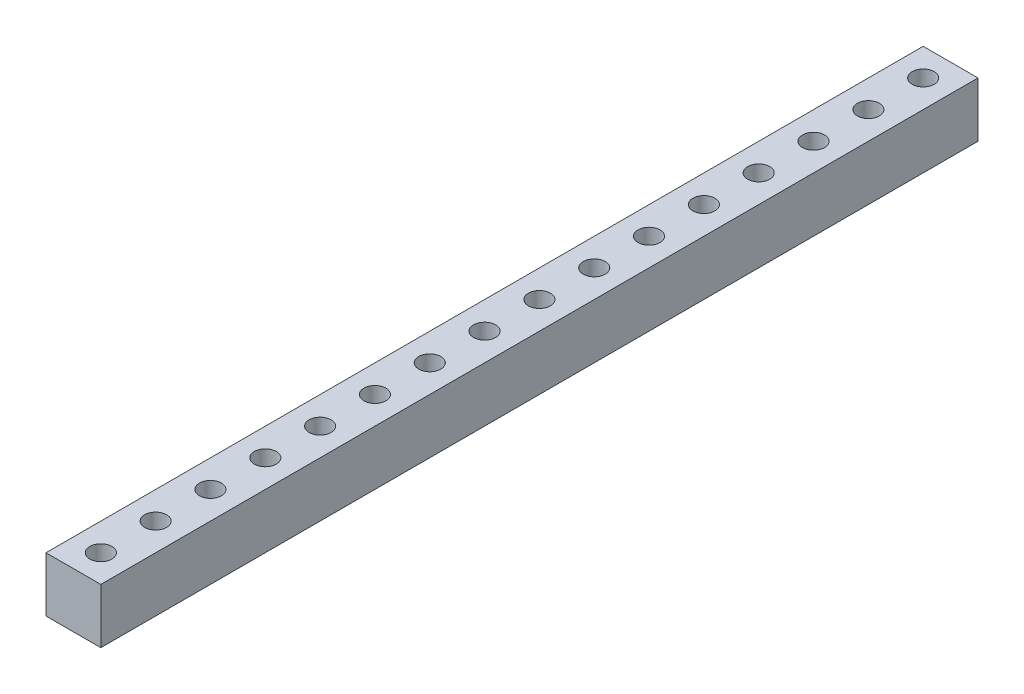
ISO-10303-21;
HEADER;
FILE_DESCRIPTION(('STEP AP214'),'2;1');
FILE_NAME('part.step','',(''),(''),'','','');
FILE_SCHEMA(('AUTOMOTIVE_DESIGN { 1 0 10303 214 1 1 1 1 }'));
ENDSEC;
DATA;
#1=APPLICATION_CONTEXT('core data for automotive mechanical design processes');
#2=APPLICATION_PROTOCOL_DEFINITION('international standard','automotive_design',2000,#1);
#3=PRODUCT_CONTEXT('',#1,'mechanical');
#4=PRODUCT('Part','Part','',(#3));
#5=PRODUCT_RELATED_PRODUCT_CATEGORY('part','',(#4));
#6=PRODUCT_DEFINITION_FORMATION('','',#4);
#7=PRODUCT_DEFINITION_CONTEXT('part definition',#1,'design');
#8=PRODUCT_DEFINITION('design','',#6,#7);
#9=PRODUCT_DEFINITION_SHAPE('','',#8);
#10=(LENGTH_UNIT() NAMED_UNIT(*) SI_UNIT(.MILLI.,.METRE.));
#11=(NAMED_UNIT(*) PLANE_ANGLE_UNIT() SI_UNIT($,.RADIAN.));
#12=(NAMED_UNIT(*) SI_UNIT($,.STERADIAN.) SOLID_ANGLE_UNIT());
#13=UNCERTAINTY_MEASURE_WITH_UNIT(LENGTH_MEASURE(1.E-05),#10,'distance_accuracy_value','');
#14=(GEOMETRIC_REPRESENTATION_CONTEXT(3) GLOBAL_UNCERTAINTY_ASSIGNED_CONTEXT((#13)) GLOBAL_UNIT_ASSIGNED_CONTEXT((#10,
#11,#12)) REPRESENTATION_CONTEXT('',''));
#15=CARTESIAN_POINT('',(0.,0.,0.));
#16=DIRECTION('',(0.,0.,1.));
#17=DIRECTION('',(1.,0.,0.));
#18=AXIS2_PLACEMENT_3D('',#15,#16,#17);
#19=CARTESIAN_POINT('',(2.54,-1.27,-20.32));
#20=DIRECTION('',(0.,0.,1.));
#21=DIRECTION('',(1.,0.,0.));
#22=AXIS2_PLACEMENT_3D('',#19,#20,#21);
#23=PLANE('',#22);
#24=DIRECTION('',(0.,1.,0.));
#25=VECTOR('',#24,1.);
#26=CARTESIAN_POINT('',(0.,-1.27,-20.32));
#27=LINE('',#26,#25);
#28=CARTESIAN_POINT('',(0.,-1.27,-20.32));
#29=VERTEX_POINT('',#28);
#30=CARTESIAN_POINT('',(0.,1.27,-20.32));
#31=VERTEX_POINT('',#30);
#32=EDGE_CURVE('E107',#29,#31,#27,.T.);
#33=ORIENTED_EDGE('',*,*,#32,.T.);
#34=DIRECTION('',(-1.,0.,0.));
#35=VECTOR('',#34,1.);
#36=CARTESIAN_POINT('',(2.54,1.27,-20.32));
#37=LINE('',#36,#35);
#38=CARTESIAN_POINT('',(2.54,1.27,-20.32));
#39=VERTEX_POINT('',#38);
#40=EDGE_CURVE('E11',#39,#31,#37,.T.);
#41=ORIENTED_EDGE('',*,*,#40,.F.);
#42=DIRECTION('',(0.,1.,0.));
#43=VECTOR('',#42,1.);
#44=CARTESIAN_POINT('',(2.54,-1.27,-20.32));
#45=LINE('',#44,#43);
#46=CARTESIAN_POINT('',(2.54,-1.27,-20.32));
#47=VERTEX_POINT('',#46);
#48=EDGE_CURVE('E91',#47,#39,#45,.T.);
#49=ORIENTED_EDGE('',*,*,#48,.F.);
#50=DIRECTION('',(-1.,0.,0.));
#51=VECTOR('',#50,1.);
#52=CARTESIAN_POINT('',(2.54,-1.27,-20.32));
#53=LINE('',#52,#51);
#54=EDGE_CURVE('E103',#47,#29,#53,.T.);
#55=ORIENTED_EDGE('',*,*,#54,.T.);
#56=EDGE_LOOP('',(#33,#41,#49,#55));
#57=FACE_BOUND('',#56,.T.);
#58=ADVANCED_FACE('F39',(#57),#23,.F.);
#59=CARTESIAN_POINT('',(2.54,1.27,20.32));
#60=DIRECTION('',(0.,-1.,0.));
#61=DIRECTION('',(0.,0.,-1.));
#62=AXIS2_PLACEMENT_3D('',#59,#60,#61);
#63=PLANE('',#62);
#64=CARTESIAN_POINT('',(1.27,1.27,-19.05));
#65=DIRECTION('',(0.,1.,0.));
#66=DIRECTION('',(0.,0.,1.));
#67=AXIS2_PLACEMENT_3D('',#64,#65,#66);
#68=CIRCLE('',#67,0.51);
#69=CARTESIAN_POINT('',(1.27,1.27,-18.54));
#70=VERTEX_POINT('',#69);
#71=EDGE_CURVE('E251',#70,#70,#68,.T.);
#72=ORIENTED_EDGE('',*,*,#71,.F.);
#73=EDGE_LOOP('',(#72));
#74=FACE_BOUND('',#73,.T.);
#75=CARTESIAN_POINT('',(1.27,1.27,-16.51));
#76=DIRECTION('',(0.,1.,0.));
#77=DIRECTION('',(0.,0.,1.));
#78=AXIS2_PLACEMENT_3D('',#75,#76,#77);
#79=CIRCLE('',#78,0.51);
#80=CARTESIAN_POINT('',(1.27,1.27,-16.));
#81=VERTEX_POINT('',#80);
#82=EDGE_CURVE('E243',#81,#81,#79,.T.);
#83=ORIENTED_EDGE('',*,*,#82,.F.);
#84=EDGE_LOOP('',(#83));
#85=FACE_BOUND('',#84,.T.);
#86=CARTESIAN_POINT('',(1.27,1.27,-13.97));
#87=DIRECTION('',(0.,1.,0.));
#88=DIRECTION('',(0.,0.,1.));
#89=AXIS2_PLACEMENT_3D('',#86,#87,#88);
#90=CIRCLE('',#89,0.51);
#91=CARTESIAN_POINT('',(1.27,1.27,-13.46));
#92=VERTEX_POINT('',#91);
#93=EDGE_CURVE('E235',#92,#92,#90,.T.);
#94=ORIENTED_EDGE('',*,*,#93,.F.);
#95=EDGE_LOOP('',(#94));
#96=FACE_BOUND('',#95,.T.);
#97=CARTESIAN_POINT('',(1.27,1.27,-11.43));
#98=DIRECTION('',(0.,1.,0.));
#99=DIRECTION('',(0.,0.,1.));
#100=AXIS2_PLACEMENT_3D('',#97,#98,#99);
#101=CIRCLE('',#100,0.51);
#102=CARTESIAN_POINT('',(1.27,1.27,-10.92));
#103=VERTEX_POINT('',#102);
#104=EDGE_CURVE('E227',#103,#103,#101,.T.);
#105=ORIENTED_EDGE('',*,*,#104,.F.);
#106=EDGE_LOOP('',(#105));
#107=FACE_BOUND('',#106,.T.);
#108=CARTESIAN_POINT('',(1.27,1.27,-8.89));
#109=DIRECTION('',(0.,1.,0.));
#110=DIRECTION('',(0.,0.,1.));
#111=AXIS2_PLACEMENT_3D('',#108,#109,#110);
#112=CIRCLE('',#111,0.51);
#113=CARTESIAN_POINT('',(1.27,1.27,-8.38));
#114=VERTEX_POINT('',#113);
#115=EDGE_CURVE('E219',#114,#114,#112,.T.);
#116=ORIENTED_EDGE('',*,*,#115,.F.);
#117=EDGE_LOOP('',(#116));
#118=FACE_BOUND('',#117,.T.);
#119=CARTESIAN_POINT('',(1.27,1.27,-6.34999999999999));
#120=DIRECTION('',(0.,1.,0.));
#121=DIRECTION('',(0.,0.,1.));
#122=AXIS2_PLACEMENT_3D('',#119,#120,#121);
#123=CIRCLE('',#122,0.51);
#124=CARTESIAN_POINT('',(1.27,1.27,-5.83999999999999));
#125=VERTEX_POINT('',#124);
#126=EDGE_CURVE('E211',#125,#125,#123,.T.);
#127=ORIENTED_EDGE('',*,*,#126,.F.);
#128=EDGE_LOOP('',(#127));
#129=FACE_BOUND('',#128,.T.);
#130=CARTESIAN_POINT('',(1.27,1.27,-3.80999999999999));
#131=DIRECTION('',(0.,1.,0.));
#132=DIRECTION('',(0.,0.,1.));
#133=AXIS2_PLACEMENT_3D('',#130,#131,#132);
#134=CIRCLE('',#133,0.51);
#135=CARTESIAN_POINT('',(1.27,1.27,-3.29999999999999));
#136=VERTEX_POINT('',#135);
#137=EDGE_CURVE('E203',#136,#136,#134,.T.);
#138=ORIENTED_EDGE('',*,*,#137,.F.);
#139=EDGE_LOOP('',(#138));
#140=FACE_BOUND('',#139,.T.);
#141=CARTESIAN_POINT('',(1.27,1.27,-1.26999999999999));
#142=DIRECTION('',(0.,1.,0.));
#143=DIRECTION('',(0.,0.,1.));
#144=AXIS2_PLACEMENT_3D('',#141,#142,#143);
#145=CIRCLE('',#144,0.51);
#146=CARTESIAN_POINT('',(1.27,1.27,-0.759999999999994));
#147=VERTEX_POINT('',#146);
#148=EDGE_CURVE('E195',#147,#147,#145,.T.);
#149=ORIENTED_EDGE('',*,*,#148,.F.);
#150=EDGE_LOOP('',(#149));
#151=FACE_BOUND('',#150,.T.);
#152=CARTESIAN_POINT('',(1.27,1.27,1.27000000000001));
#153=DIRECTION('',(0.,1.,0.));
#154=DIRECTION('',(0.,0.,1.));
#155=AXIS2_PLACEMENT_3D('',#152,#153,#154);
#156=CIRCLE('',#155,0.51);
#157=CARTESIAN_POINT('',(1.27,1.27,1.78000000000001));
#158=VERTEX_POINT('',#157);
#159=EDGE_CURVE('E187',#158,#158,#156,.T.);
#160=ORIENTED_EDGE('',*,*,#159,.F.);
#161=EDGE_LOOP('',(#160));
#162=FACE_BOUND('',#161,.T.);
#163=CARTESIAN_POINT('',(1.27,1.27,3.81000000000001));
#164=DIRECTION('',(0.,1.,0.));
#165=DIRECTION('',(0.,0.,1.));
#166=AXIS2_PLACEMENT_3D('',#163,#164,#165);
#167=CIRCLE('',#166,0.51);
#168=CARTESIAN_POINT('',(1.27,1.27,4.32000000000001));
#169=VERTEX_POINT('',#168);
#170=EDGE_CURVE('E179',#169,#169,#167,.T.);
#171=ORIENTED_EDGE('',*,*,#170,.F.);
#172=EDGE_LOOP('',(#171));
#173=FACE_BOUND('',#172,.T.);
#174=CARTESIAN_POINT('',(1.27,1.27,6.35000000000001));
#175=DIRECTION('',(0.,1.,0.));
#176=DIRECTION('',(0.,0.,1.));
#177=AXIS2_PLACEMENT_3D('',#174,#175,#176);
#178=CIRCLE('',#177,0.51);
#179=CARTESIAN_POINT('',(1.27,1.27,6.86000000000001));
#180=VERTEX_POINT('',#179);
#181=EDGE_CURVE('E171',#180,#180,#178,.T.);
#182=ORIENTED_EDGE('',*,*,#181,.F.);
#183=EDGE_LOOP('',(#182));
#184=FACE_BOUND('',#183,.T.);
#185=CARTESIAN_POINT('',(1.27,1.27,8.89000000000001));
#186=DIRECTION('',(0.,1.,0.));
#187=DIRECTION('',(0.,0.,1.));
#188=AXIS2_PLACEMENT_3D('',#185,#186,#187);
#189=CIRCLE('',#188,0.51);
#190=CARTESIAN_POINT('',(1.27,1.27,9.40000000000001));
#191=VERTEX_POINT('',#190);
#192=EDGE_CURVE('E163',#191,#191,#189,.T.);
#193=ORIENTED_EDGE('',*,*,#192,.F.);
#194=EDGE_LOOP('',(#193));
#195=FACE_BOUND('',#194,.T.);
#196=CARTESIAN_POINT('',(1.27,1.27,11.43));
#197=DIRECTION('',(0.,1.,0.));
#198=DIRECTION('',(0.,0.,1.));
#199=AXIS2_PLACEMENT_3D('',#196,#197,#198);
#200=CIRCLE('',#199,0.51);
#201=CARTESIAN_POINT('',(1.27,1.27,11.94));
#202=VERTEX_POINT('',#201);
#203=EDGE_CURVE('E155',#202,#202,#200,.T.);
#204=ORIENTED_EDGE('',*,*,#203,.F.);
#205=EDGE_LOOP('',(#204));
#206=FACE_BOUND('',#205,.T.);
#207=CARTESIAN_POINT('',(1.27,1.27,13.97));
#208=DIRECTION('',(0.,1.,0.));
#209=DIRECTION('',(0.,0.,1.));
#210=AXIS2_PLACEMENT_3D('',#207,#208,#209);
#211=CIRCLE('',#210,0.51);
#212=CARTESIAN_POINT('',(1.27,1.27,14.48));
#213=VERTEX_POINT('',#212);
#214=EDGE_CURVE('E147',#213,#213,#211,.T.);
#215=ORIENTED_EDGE('',*,*,#214,.F.);
#216=EDGE_LOOP('',(#215));
#217=FACE_BOUND('',#216,.T.);
#218=CARTESIAN_POINT('',(1.27,1.27,16.51));
#219=DIRECTION('',(0.,1.,0.));
#220=DIRECTION('',(0.,0.,1.));
#221=AXIS2_PLACEMENT_3D('',#218,#219,#220);
#222=CIRCLE('',#221,0.51);
#223=CARTESIAN_POINT('',(1.27,1.27,17.02));
#224=VERTEX_POINT('',#223);
#225=EDGE_CURVE('E139',#224,#224,#222,.T.);
#226=ORIENTED_EDGE('',*,*,#225,.F.);
#227=EDGE_LOOP('',(#226));
#228=FACE_BOUND('',#227,.T.);
#229=CARTESIAN_POINT('',(1.27,1.27,19.05));
#230=DIRECTION('',(0.,1.,0.));
#231=DIRECTION('',(0.,0.,1.));
#232=AXIS2_PLACEMENT_3D('',#229,#230,#231);
#233=CIRCLE('',#232,0.51);
#234=CARTESIAN_POINT('',(1.27,1.27,19.56));
#235=VERTEX_POINT('',#234);
#236=EDGE_CURVE('E131',#235,#235,#233,.T.);
#237=ORIENTED_EDGE('',*,*,#236,.F.);
#238=EDGE_LOOP('',(#237));
#239=FACE_BOUND('',#238,.T.);
#240=DIRECTION('',(0.,0.,1.));
#241=VECTOR('',#240,1.);
#242=CARTESIAN_POINT('',(0.,1.27,20.32));
#243=LINE('',#242,#241);
#244=CARTESIAN_POINT('',(0.,1.27,20.32));
#245=VERTEX_POINT('',#244);
#246=EDGE_CURVE('E96',#31,#245,#243,.T.);
#247=ORIENTED_EDGE('',*,*,#246,.T.);
#248=DIRECTION('',(-1.,0.,0.));
#249=VECTOR('',#248,1.);
#250=CARTESIAN_POINT('',(2.54,1.27,20.32));
#251=LINE('',#250,#249);
#252=CARTESIAN_POINT('',(2.54,1.27,20.32));
#253=VERTEX_POINT('',#252);
#254=EDGE_CURVE('E48',#253,#245,#251,.T.);
#255=ORIENTED_EDGE('',*,*,#254,.F.);
#256=DIRECTION('',(0.,0.,1.));
#257=VECTOR('',#256,1.);
#258=CARTESIAN_POINT('',(2.54,1.27,20.32));
#259=LINE('',#258,#257);
#260=EDGE_CURVE('E86',#39,#253,#259,.T.);
#261=ORIENTED_EDGE('',*,*,#260,.F.);
#262=ORIENTED_EDGE('',*,*,#40,.T.);
#263=EDGE_LOOP('',(#247,#255,#261,#262));
#264=FACE_BOUND('',#263,.T.);
#265=ADVANCED_FACE('F95',(#74,#85,#96,#107,#118,#129,#140,#151,#162,#173,#184,#195,#206,#217,
#228,#239,#264),#63,.F.);
#266=CARTESIAN_POINT('',(2.54,-1.27,20.32));
#267=DIRECTION('',(0.,0.,-1.));
#268=DIRECTION('',(-1.,0.,0.));
#269=AXIS2_PLACEMENT_3D('',#266,#267,#268);
#270=PLANE('',#269);
#271=DIRECTION('',(0.,-1.,0.));
#272=VECTOR('',#271,1.);
#273=CARTESIAN_POINT('',(0.,-1.27,20.32));
#274=LINE('',#273,#272);
#275=CARTESIAN_POINT('',(0.,-1.27,20.32));
#276=VERTEX_POINT('',#275);
#277=EDGE_CURVE('E73',#245,#276,#274,.T.);
#278=ORIENTED_EDGE('',*,*,#277,.T.);
#279=DIRECTION('',(-1.,0.,0.));
#280=VECTOR('',#279,1.);
#281=CARTESIAN_POINT('',(2.54,-1.27,20.32));
#282=LINE('',#281,#280);
#283=CARTESIAN_POINT('',(2.54,-1.27,20.32));
#284=VERTEX_POINT('',#283);
#285=EDGE_CURVE('E98',#284,#276,#282,.T.);
#286=ORIENTED_EDGE('',*,*,#285,.F.);
#287=DIRECTION('',(0.,-1.,0.));
#288=VECTOR('',#287,1.);
#289=CARTESIAN_POINT('',(2.54,-1.27,20.32));
#290=LINE('',#289,#288);
#291=EDGE_CURVE('E89',#253,#284,#290,.T.);
#292=ORIENTED_EDGE('',*,*,#291,.F.);
#293=ORIENTED_EDGE('',*,*,#254,.T.);
#294=EDGE_LOOP('',(#278,#286,#292,#293));
#295=FACE_BOUND('',#294,.T.);
#296=ADVANCED_FACE('F99',(#295),#270,.F.);
#297=CARTESIAN_POINT('',(2.54,-1.27,20.32));
#298=DIRECTION('',(0.,1.,0.));
#299=DIRECTION('',(0.,0.,1.));
#300=AXIS2_PLACEMENT_3D('',#297,#298,#299);
#301=PLANE('',#300);
#302=CARTESIAN_POINT('',(1.27,-1.27,-19.05));
#303=DIRECTION('',(0.,1.,0.));
#304=DIRECTION('',(0.,0.,1.));
#305=AXIS2_PLACEMENT_3D('',#302,#303,#304);
#306=CIRCLE('',#305,0.51);
#307=CARTESIAN_POINT('',(1.27,-1.27,-18.54));
#308=VERTEX_POINT('',#307);
#309=EDGE_CURVE('E247',#308,#308,#306,.T.);
#310=ORIENTED_EDGE('',*,*,#309,.T.);
#311=EDGE_LOOP('',(#310));
#312=FACE_BOUND('',#311,.T.);
#313=CARTESIAN_POINT('',(1.27,-1.27,-16.51));
#314=DIRECTION('',(0.,1.,0.));
#315=DIRECTION('',(0.,0.,1.));
#316=AXIS2_PLACEMENT_3D('',#313,#314,#315);
#317=CIRCLE('',#316,0.51);
#318=CARTESIAN_POINT('',(1.27,-1.27,-16.));
#319=VERTEX_POINT('',#318);
#320=EDGE_CURVE('E239',#319,#319,#317,.T.);
#321=ORIENTED_EDGE('',*,*,#320,.T.);
#322=EDGE_LOOP('',(#321));
#323=FACE_BOUND('',#322,.T.);
#324=CARTESIAN_POINT('',(1.27,-1.27,-13.97));
#325=DIRECTION('',(0.,1.,0.));
#326=DIRECTION('',(0.,0.,1.));
#327=AXIS2_PLACEMENT_3D('',#324,#325,#326);
#328=CIRCLE('',#327,0.51);
#329=CARTESIAN_POINT('',(1.27,-1.27,-13.46));
#330=VERTEX_POINT('',#329);
#331=EDGE_CURVE('E231',#330,#330,#328,.T.);
#332=ORIENTED_EDGE('',*,*,#331,.T.);
#333=EDGE_LOOP('',(#332));
#334=FACE_BOUND('',#333,.T.);
#335=CARTESIAN_POINT('',(1.27,-1.27,-11.43));
#336=DIRECTION('',(0.,1.,0.));
#337=DIRECTION('',(0.,0.,1.));
#338=AXIS2_PLACEMENT_3D('',#335,#336,#337);
#339=CIRCLE('',#338,0.51);
#340=CARTESIAN_POINT('',(1.27,-1.27,-10.92));
#341=VERTEX_POINT('',#340);
#342=EDGE_CURVE('E223',#341,#341,#339,.T.);
#343=ORIENTED_EDGE('',*,*,#342,.T.);
#344=EDGE_LOOP('',(#343));
#345=FACE_BOUND('',#344,.T.);
#346=CARTESIAN_POINT('',(1.27,-1.27,-8.89));
#347=DIRECTION('',(0.,1.,0.));
#348=DIRECTION('',(0.,0.,1.));
#349=AXIS2_PLACEMENT_3D('',#346,#347,#348);
#350=CIRCLE('',#349,0.51);
#351=CARTESIAN_POINT('',(1.27,-1.27,-8.38));
#352=VERTEX_POINT('',#351);
#353=EDGE_CURVE('E215',#352,#352,#350,.T.);
#354=ORIENTED_EDGE('',*,*,#353,.T.);
#355=EDGE_LOOP('',(#354));
#356=FACE_BOUND('',#355,.T.);
#357=CARTESIAN_POINT('',(1.27,-1.27,-6.34999999999999));
#358=DIRECTION('',(0.,1.,0.));
#359=DIRECTION('',(0.,0.,1.));
#360=AXIS2_PLACEMENT_3D('',#357,#358,#359);
#361=CIRCLE('',#360,0.51);
#362=CARTESIAN_POINT('',(1.27,-1.27,-5.83999999999999));
#363=VERTEX_POINT('',#362);
#364=EDGE_CURVE('E207',#363,#363,#361,.T.);
#365=ORIENTED_EDGE('',*,*,#364,.T.);
#366=EDGE_LOOP('',(#365));
#367=FACE_BOUND('',#366,.T.);
#368=CARTESIAN_POINT('',(1.27,-1.27,-3.80999999999999));
#369=DIRECTION('',(0.,1.,0.));
#370=DIRECTION('',(0.,0.,1.));
#371=AXIS2_PLACEMENT_3D('',#368,#369,#370);
#372=CIRCLE('',#371,0.51);
#373=CARTESIAN_POINT('',(1.27,-1.27,-3.29999999999999));
#374=VERTEX_POINT('',#373);
#375=EDGE_CURVE('E199',#374,#374,#372,.T.);
#376=ORIENTED_EDGE('',*,*,#375,.T.);
#377=EDGE_LOOP('',(#376));
#378=FACE_BOUND('',#377,.T.);
#379=CARTESIAN_POINT('',(1.27,-1.27,-1.26999999999999));
#380=DIRECTION('',(0.,1.,0.));
#381=DIRECTION('',(0.,0.,1.));
#382=AXIS2_PLACEMENT_3D('',#379,#380,#381);
#383=CIRCLE('',#382,0.51);
#384=CARTESIAN_POINT('',(1.27,-1.27,-0.759999999999994));
#385=VERTEX_POINT('',#384);
#386=EDGE_CURVE('E191',#385,#385,#383,.T.);
#387=ORIENTED_EDGE('',*,*,#386,.T.);
#388=EDGE_LOOP('',(#387));
#389=FACE_BOUND('',#388,.T.);
#390=CARTESIAN_POINT('',(1.27,-1.27,1.27000000000001));
#391=DIRECTION('',(0.,1.,0.));
#392=DIRECTION('',(0.,0.,1.));
#393=AXIS2_PLACEMENT_3D('',#390,#391,#392);
#394=CIRCLE('',#393,0.51);
#395=CARTESIAN_POINT('',(1.27,-1.27,1.78000000000001));
#396=VERTEX_POINT('',#395);
#397=EDGE_CURVE('E183',#396,#396,#394,.T.);
#398=ORIENTED_EDGE('',*,*,#397,.T.);
#399=EDGE_LOOP('',(#398));
#400=FACE_BOUND('',#399,.T.);
#401=CARTESIAN_POINT('',(1.27,-1.27,3.81000000000001));
#402=DIRECTION('',(0.,1.,0.));
#403=DIRECTION('',(0.,0.,1.));
#404=AXIS2_PLACEMENT_3D('',#401,#402,#403);
#405=CIRCLE('',#404,0.51);
#406=CARTESIAN_POINT('',(1.27,-1.27,4.32000000000001));
#407=VERTEX_POINT('',#406);
#408=EDGE_CURVE('E175',#407,#407,#405,.T.);
#409=ORIENTED_EDGE('',*,*,#408,.T.);
#410=EDGE_LOOP('',(#409));
#411=FACE_BOUND('',#410,.T.);
#412=CARTESIAN_POINT('',(1.27,-1.27,6.35000000000001));
#413=DIRECTION('',(0.,1.,0.));
#414=DIRECTION('',(0.,0.,1.));
#415=AXIS2_PLACEMENT_3D('',#412,#413,#414);
#416=CIRCLE('',#415,0.51);
#417=CARTESIAN_POINT('',(1.27,-1.27,6.86000000000001));
#418=VERTEX_POINT('',#417);
#419=EDGE_CURVE('E167',#418,#418,#416,.T.);
#420=ORIENTED_EDGE('',*,*,#419,.T.);
#421=EDGE_LOOP('',(#420));
#422=FACE_BOUND('',#421,.T.);
#423=CARTESIAN_POINT('',(1.27,-1.27,8.89000000000001));
#424=DIRECTION('',(0.,1.,0.));
#425=DIRECTION('',(0.,0.,1.));
#426=AXIS2_PLACEMENT_3D('',#423,#424,#425);
#427=CIRCLE('',#426,0.51);
#428=CARTESIAN_POINT('',(1.27,-1.27,9.40000000000001));
#429=VERTEX_POINT('',#428);
#430=EDGE_CURVE('E159',#429,#429,#427,.T.);
#431=ORIENTED_EDGE('',*,*,#430,.T.);
#432=EDGE_LOOP('',(#431));
#433=FACE_BOUND('',#432,.T.);
#434=CARTESIAN_POINT('',(1.27,-1.27,11.43));
#435=DIRECTION('',(0.,1.,0.));
#436=DIRECTION('',(0.,0.,1.));
#437=AXIS2_PLACEMENT_3D('',#434,#435,#436);
#438=CIRCLE('',#437,0.51);
#439=CARTESIAN_POINT('',(1.27,-1.27,11.94));
#440=VERTEX_POINT('',#439);
#441=EDGE_CURVE('E151',#440,#440,#438,.T.);
#442=ORIENTED_EDGE('',*,*,#441,.T.);
#443=EDGE_LOOP('',(#442));
#444=FACE_BOUND('',#443,.T.);
#445=CARTESIAN_POINT('',(1.27,-1.27,13.97));
#446=DIRECTION('',(0.,1.,0.));
#447=DIRECTION('',(0.,0.,1.));
#448=AXIS2_PLACEMENT_3D('',#445,#446,#447);
#449=CIRCLE('',#448,0.51);
#450=CARTESIAN_POINT('',(1.27,-1.27,14.48));
#451=VERTEX_POINT('',#450);
#452=EDGE_CURVE('E143',#451,#451,#449,.T.);
#453=ORIENTED_EDGE('',*,*,#452,.T.);
#454=EDGE_LOOP('',(#453));
#455=FACE_BOUND('',#454,.T.);
#456=CARTESIAN_POINT('',(1.27,-1.27,16.51));
#457=DIRECTION('',(0.,1.,0.));
#458=DIRECTION('',(0.,0.,1.));
#459=AXIS2_PLACEMENT_3D('',#456,#457,#458);
#460=CIRCLE('',#459,0.51);
#461=CARTESIAN_POINT('',(1.27,-1.27,17.02));
#462=VERTEX_POINT('',#461);
#463=EDGE_CURVE('E135',#462,#462,#460,.T.);
#464=ORIENTED_EDGE('',*,*,#463,.T.);
#465=EDGE_LOOP('',(#464));
#466=FACE_BOUND('',#465,.T.);
#467=CARTESIAN_POINT('',(1.27,-1.27,19.05));
#468=DIRECTION('',(0.,1.,0.));
#469=DIRECTION('',(0.,0.,1.));
#470=AXIS2_PLACEMENT_3D('',#467,#468,#469);
#471=CIRCLE('',#470,0.51);
#472=CARTESIAN_POINT('',(1.27,-1.27,19.56));
#473=VERTEX_POINT('',#472);
#474=EDGE_CURVE('E111',#473,#473,#471,.T.);
#475=ORIENTED_EDGE('',*,*,#474,.T.);
#476=EDGE_LOOP('',(#475));
#477=FACE_BOUND('',#476,.T.);
#478=DIRECTION('',(0.,0.,-1.));
#479=VECTOR('',#478,1.);
#480=CARTESIAN_POINT('',(0.,-1.27,20.32));
#481=LINE('',#480,#479);
#482=EDGE_CURVE('E79',#276,#29,#481,.T.);
#483=ORIENTED_EDGE('',*,*,#482,.T.);
#484=ORIENTED_EDGE('',*,*,#54,.F.);
#485=DIRECTION('',(0.,0.,-1.));
#486=VECTOR('',#485,1.);
#487=CARTESIAN_POINT('',(2.54,-1.27,20.32));
#488=LINE('',#487,#486);
#489=EDGE_CURVE('E56',#284,#47,#488,.T.);
#490=ORIENTED_EDGE('',*,*,#489,.F.);
#491=ORIENTED_EDGE('',*,*,#285,.T.);
#492=EDGE_LOOP('',(#483,#484,#490,#491));
#493=FACE_BOUND('',#492,.T.);
#494=ADVANCED_FACE('F121',(#312,#323,#334,#345,#356,#367,#378,#389,#400,#411,#422,#433,#444,
#455,#466,#477,#493),#301,.F.);
#495=CARTESIAN_POINT('',(2.54,0.,0.));
#496=DIRECTION('',(-1.,0.,0.));
#497=DIRECTION('',(0.,0.,1.));
#498=AXIS2_PLACEMENT_3D('',#495,#496,#497);
#499=PLANE('',#498);
#500=ORIENTED_EDGE('',*,*,#48,.T.);
#501=ORIENTED_EDGE('',*,*,#260,.T.);
#502=ORIENTED_EDGE('',*,*,#291,.T.);
#503=ORIENTED_EDGE('',*,*,#489,.T.);
#504=EDGE_LOOP('',(#500,#501,#502,#503));
#505=FACE_BOUND('',#504,.T.);
#506=ADVANCED_FACE('F87',(#505),#499,.F.);
#507=CARTESIAN_POINT('',(0.,0.,0.));
#508=DIRECTION('',(-1.,0.,0.));
#509=DIRECTION('',(0.,0.,1.));
#510=AXIS2_PLACEMENT_3D('',#507,#508,#509);
#511=PLANE('',#510);
#512=ORIENTED_EDGE('',*,*,#32,.F.);
#513=ORIENTED_EDGE('',*,*,#482,.F.);
#514=ORIENTED_EDGE('',*,*,#277,.F.);
#515=ORIENTED_EDGE('',*,*,#246,.F.);
#516=EDGE_LOOP('',(#512,#513,#514,#515));
#517=FACE_BOUND('',#516,.T.);
#518=ADVANCED_FACE('F124',(#517),#511,.T.);
#519=CARTESIAN_POINT('',(1.27,1.27,19.05));
#520=DIRECTION('',(0.,1.,0.));
#521=DIRECTION('',(0.,0.,1.));
#522=AXIS2_PLACEMENT_3D('',#519,#520,#521);
#523=CYLINDRICAL_SURFACE('',#522,0.51);
#524=ORIENTED_EDGE('',*,*,#474,.F.);
#525=EDGE_LOOP('',(#524));
#526=FACE_BOUND('',#525,.T.);
#527=ORIENTED_EDGE('',*,*,#236,.T.);
#528=EDGE_LOOP('',(#527));
#529=FACE_BOUND('',#528,.T.);
#530=ADVANCED_FACE('F290',(#526,#529),#523,.F.);
#531=CARTESIAN_POINT('',(1.27,1.27,16.51));
#532=DIRECTION('',(0.,1.,0.));
#533=DIRECTION('',(0.,0.,1.));
#534=AXIS2_PLACEMENT_3D('',#531,#532,#533);
#535=CYLINDRICAL_SURFACE('',#534,0.51);
#536=ORIENTED_EDGE('',*,*,#463,.F.);
#537=EDGE_LOOP('',(#536));
#538=FACE_BOUND('',#537,.T.);
#539=ORIENTED_EDGE('',*,*,#225,.T.);
#540=EDGE_LOOP('',(#539));
#541=FACE_BOUND('',#540,.T.);
#542=ADVANCED_FACE('F292',(#538,#541),#535,.F.);
#543=CARTESIAN_POINT('',(1.27,1.27,13.97));
#544=DIRECTION('',(0.,1.,0.));
#545=DIRECTION('',(0.,0.,1.));
#546=AXIS2_PLACEMENT_3D('',#543,#544,#545);
#547=CYLINDRICAL_SURFACE('',#546,0.51);
#548=ORIENTED_EDGE('',*,*,#452,.F.);
#549=EDGE_LOOP('',(#548));
#550=FACE_BOUND('',#549,.T.);
#551=ORIENTED_EDGE('',*,*,#214,.T.);
#552=EDGE_LOOP('',(#551));
#553=FACE_BOUND('',#552,.T.);
#554=ADVANCED_FACE('F299',(#550,#553),#547,.F.);
#555=CARTESIAN_POINT('',(1.27,1.27,11.43));
#556=DIRECTION('',(0.,1.,0.));
#557=DIRECTION('',(0.,0.,1.));
#558=AXIS2_PLACEMENT_3D('',#555,#556,#557);
#559=CYLINDRICAL_SURFACE('',#558,0.51);
#560=ORIENTED_EDGE('',*,*,#441,.F.);
#561=EDGE_LOOP('',(#560));
#562=FACE_BOUND('',#561,.T.);
#563=ORIENTED_EDGE('',*,*,#203,.T.);
#564=EDGE_LOOP('',(#563));
#565=FACE_BOUND('',#564,.T.);
#566=ADVANCED_FACE('F353',(#562,#565),#559,.F.);
#567=CARTESIAN_POINT('',(1.27,1.27,8.89000000000001));
#568=DIRECTION('',(0.,1.,0.));
#569=DIRECTION('',(0.,0.,1.));
#570=AXIS2_PLACEMENT_3D('',#567,#568,#569);
#571=CYLINDRICAL_SURFACE('',#570,0.51);
#572=ORIENTED_EDGE('',*,*,#430,.F.);
#573=EDGE_LOOP('',(#572));
#574=FACE_BOUND('',#573,.T.);
#575=ORIENTED_EDGE('',*,*,#192,.T.);
#576=EDGE_LOOP('',(#575));
#577=FACE_BOUND('',#576,.T.);
#578=ADVANCED_FACE('F362',(#574,#577),#571,.F.);
#579=CARTESIAN_POINT('',(1.27,1.27,6.35000000000001));
#580=DIRECTION('',(0.,1.,0.));
#581=DIRECTION('',(0.,0.,1.));
#582=AXIS2_PLACEMENT_3D('',#579,#580,#581);
#583=CYLINDRICAL_SURFACE('',#582,0.51);
#584=ORIENTED_EDGE('',*,*,#419,.F.);
#585=EDGE_LOOP('',(#584));
#586=FACE_BOUND('',#585,.T.);
#587=ORIENTED_EDGE('',*,*,#181,.T.);
#588=EDGE_LOOP('',(#587));
#589=FACE_BOUND('',#588,.T.);
#590=ADVANCED_FACE('F371',(#586,#589),#583,.F.);
#591=CARTESIAN_POINT('',(1.27,1.27,3.81000000000001));
#592=DIRECTION('',(0.,1.,0.));
#593=DIRECTION('',(0.,0.,1.));
#594=AXIS2_PLACEMENT_3D('',#591,#592,#593);
#595=CYLINDRICAL_SURFACE('',#594,0.51);
#596=ORIENTED_EDGE('',*,*,#408,.F.);
#597=EDGE_LOOP('',(#596));
#598=FACE_BOUND('',#597,.T.);
#599=ORIENTED_EDGE('',*,*,#170,.T.);
#600=EDGE_LOOP('',(#599));
#601=FACE_BOUND('',#600,.T.);
#602=ADVANCED_FACE('F380',(#598,#601),#595,.F.);
#603=CARTESIAN_POINT('',(1.27,1.27,1.27000000000001));
#604=DIRECTION('',(0.,1.,0.));
#605=DIRECTION('',(0.,0.,1.));
#606=AXIS2_PLACEMENT_3D('',#603,#604,#605);
#607=CYLINDRICAL_SURFACE('',#606,0.51);
#608=ORIENTED_EDGE('',*,*,#397,.F.);
#609=EDGE_LOOP('',(#608));
#610=FACE_BOUND('',#609,.T.);
#611=ORIENTED_EDGE('',*,*,#159,.T.);
#612=EDGE_LOOP('',(#611));
#613=FACE_BOUND('',#612,.T.);
#614=ADVANCED_FACE('F389',(#610,#613),#607,.F.);
#615=CARTESIAN_POINT('',(1.27,1.27,-1.26999999999999));
#616=DIRECTION('',(0.,1.,0.));
#617=DIRECTION('',(0.,0.,1.));
#618=AXIS2_PLACEMENT_3D('',#615,#616,#617);
#619=CYLINDRICAL_SURFACE('',#618,0.51);
#620=ORIENTED_EDGE('',*,*,#386,.F.);
#621=EDGE_LOOP('',(#620));
#622=FACE_BOUND('',#621,.T.);
#623=ORIENTED_EDGE('',*,*,#148,.T.);
#624=EDGE_LOOP('',(#623));
#625=FACE_BOUND('',#624,.T.);
#626=ADVANCED_FACE('F398',(#622,#625),#619,.F.);
#627=CARTESIAN_POINT('',(1.27,1.27,-3.80999999999999));
#628=DIRECTION('',(0.,1.,0.));
#629=DIRECTION('',(0.,0.,1.));
#630=AXIS2_PLACEMENT_3D('',#627,#628,#629);
#631=CYLINDRICAL_SURFACE('',#630,0.51);
#632=ORIENTED_EDGE('',*,*,#375,.F.);
#633=EDGE_LOOP('',(#632));
#634=FACE_BOUND('',#633,.T.);
#635=ORIENTED_EDGE('',*,*,#137,.T.);
#636=EDGE_LOOP('',(#635));
#637=FACE_BOUND('',#636,.T.);
#638=ADVANCED_FACE('F407',(#634,#637),#631,.F.);
#639=CARTESIAN_POINT('',(1.27,1.27,-6.34999999999999));
#640=DIRECTION('',(0.,1.,0.));
#641=DIRECTION('',(0.,0.,1.));
#642=AXIS2_PLACEMENT_3D('',#639,#640,#641);
#643=CYLINDRICAL_SURFACE('',#642,0.51);
#644=ORIENTED_EDGE('',*,*,#364,.F.);
#645=EDGE_LOOP('',(#644));
#646=FACE_BOUND('',#645,.T.);
#647=ORIENTED_EDGE('',*,*,#126,.T.);
#648=EDGE_LOOP('',(#647));
#649=FACE_BOUND('',#648,.T.);
#650=ADVANCED_FACE('F416',(#646,#649),#643,.F.);
#651=CARTESIAN_POINT('',(1.27,1.27,-8.89));
#652=DIRECTION('',(0.,1.,0.));
#653=DIRECTION('',(0.,0.,1.));
#654=AXIS2_PLACEMENT_3D('',#651,#652,#653);
#655=CYLINDRICAL_SURFACE('',#654,0.51);
#656=ORIENTED_EDGE('',*,*,#353,.F.);
#657=EDGE_LOOP('',(#656));
#658=FACE_BOUND('',#657,.T.);
#659=ORIENTED_EDGE('',*,*,#115,.T.);
#660=EDGE_LOOP('',(#659));
#661=FACE_BOUND('',#660,.T.);
#662=ADVANCED_FACE('F425',(#658,#661),#655,.F.);
#663=CARTESIAN_POINT('',(1.27,1.27,-11.43));
#664=DIRECTION('',(0.,1.,0.));
#665=DIRECTION('',(0.,0.,1.));
#666=AXIS2_PLACEMENT_3D('',#663,#664,#665);
#667=CYLINDRICAL_SURFACE('',#666,0.51);
#668=ORIENTED_EDGE('',*,*,#342,.F.);
#669=EDGE_LOOP('',(#668));
#670=FACE_BOUND('',#669,.T.);
#671=ORIENTED_EDGE('',*,*,#104,.T.);
#672=EDGE_LOOP('',(#671));
#673=FACE_BOUND('',#672,.T.);
#674=ADVANCED_FACE('F434',(#670,#673),#667,.F.);
#675=CARTESIAN_POINT('',(1.27,1.27,-13.97));
#676=DIRECTION('',(0.,1.,0.));
#677=DIRECTION('',(0.,0.,1.));
#678=AXIS2_PLACEMENT_3D('',#675,#676,#677);
#679=CYLINDRICAL_SURFACE('',#678,0.51);
#680=ORIENTED_EDGE('',*,*,#331,.F.);
#681=EDGE_LOOP('',(#680));
#682=FACE_BOUND('',#681,.T.);
#683=ORIENTED_EDGE('',*,*,#93,.T.);
#684=EDGE_LOOP('',(#683));
#685=FACE_BOUND('',#684,.T.);
#686=ADVANCED_FACE('F443',(#682,#685),#679,.F.);
#687=CARTESIAN_POINT('',(1.27,1.27,-16.51));
#688=DIRECTION('',(0.,1.,0.));
#689=DIRECTION('',(0.,0.,1.));
#690=AXIS2_PLACEMENT_3D('',#687,#688,#689);
#691=CYLINDRICAL_SURFACE('',#690,0.51);
#692=ORIENTED_EDGE('',*,*,#320,.F.);
#693=EDGE_LOOP('',(#692));
#694=FACE_BOUND('',#693,.T.);
#695=ORIENTED_EDGE('',*,*,#82,.T.);
#696=EDGE_LOOP('',(#695));
#697=FACE_BOUND('',#696,.T.);
#698=ADVANCED_FACE('F452',(#694,#697),#691,.F.);
#699=CARTESIAN_POINT('',(1.27,1.27,-19.05));
#700=DIRECTION('',(0.,1.,0.));
#701=DIRECTION('',(0.,0.,1.));
#702=AXIS2_PLACEMENT_3D('',#699,#700,#701);
#703=CYLINDRICAL_SURFACE('',#702,0.51);
#704=ORIENTED_EDGE('',*,*,#309,.F.);
#705=EDGE_LOOP('',(#704));
#706=FACE_BOUND('',#705,.T.);
#707=ORIENTED_EDGE('',*,*,#71,.T.);
#708=EDGE_LOOP('',(#707));
#709=FACE_BOUND('',#708,.T.);
#710=ADVANCED_FACE('F256',(#706,#709),#703,.F.);
#711=CLOSED_SHELL('',(#58,#265,#296,#494,#506,#518,#530,#542,#554,#566,#578,#590,#602,#614,#626,
#638,#650,#662,#674,#686,#698,#710));
#712=MANIFOLD_SOLID_BREP('B2',#711);
#713=ADVANCED_BREP_SHAPE_REPRESENTATION('',(#18,#712),#14);
#714=SHAPE_DEFINITION_REPRESENTATION(#9,#713);
ENDSEC;
END-ISO-10303-21;
